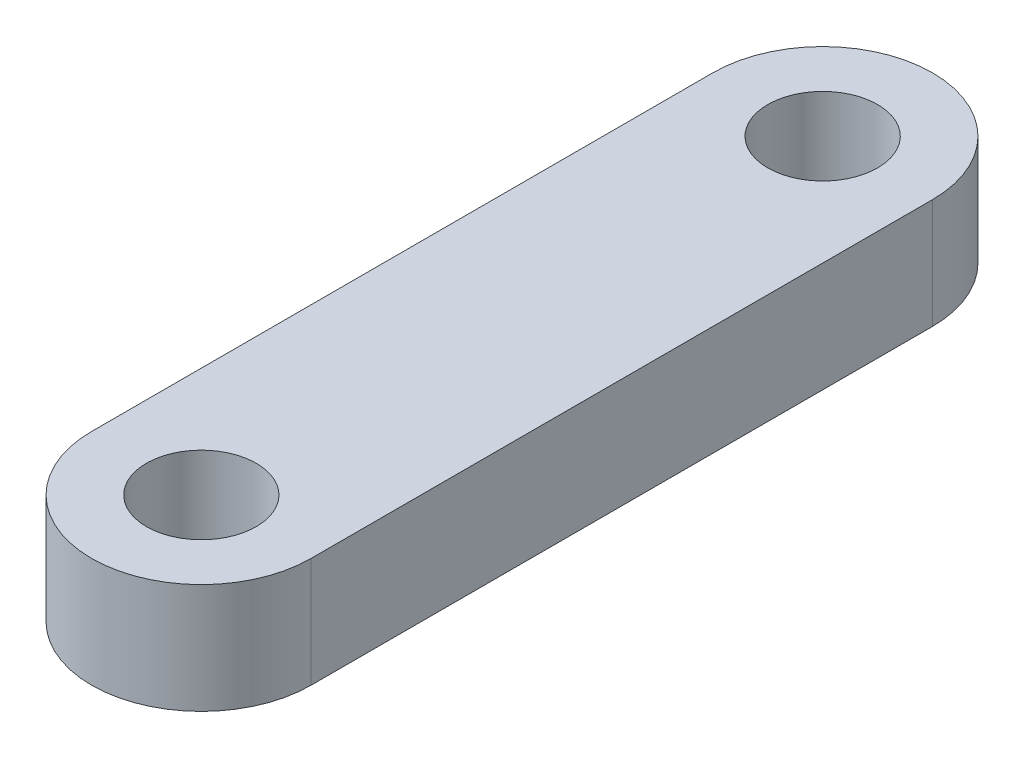
ISO-10303-21;
HEADER;
FILE_DESCRIPTION(('STEP AP214'),'2;1');
FILE_NAME('part.step','',(''),(''),'','','');
FILE_SCHEMA(('AUTOMOTIVE_DESIGN { 1 0 10303 214 1 1 1 1 }'));
ENDSEC;
DATA;
#1=APPLICATION_CONTEXT('core data for automotive mechanical design processes');
#2=APPLICATION_PROTOCOL_DEFINITION('international standard','automotive_design',2000,#1);
#3=PRODUCT_CONTEXT('',#1,'mechanical');
#4=PRODUCT('Part','Part','',(#3));
#5=PRODUCT_RELATED_PRODUCT_CATEGORY('part','',(#4));
#6=PRODUCT_DEFINITION_FORMATION('','',#4);
#7=PRODUCT_DEFINITION_CONTEXT('part definition',#1,'design');
#8=PRODUCT_DEFINITION('design','',#6,#7);
#9=PRODUCT_DEFINITION_SHAPE('','',#8);
#10=(LENGTH_UNIT() NAMED_UNIT(*) SI_UNIT(.MILLI.,.METRE.));
#11=(NAMED_UNIT(*) PLANE_ANGLE_UNIT() SI_UNIT($,.RADIAN.));
#12=(NAMED_UNIT(*) SI_UNIT($,.STERADIAN.) SOLID_ANGLE_UNIT());
#13=UNCERTAINTY_MEASURE_WITH_UNIT(LENGTH_MEASURE(1.E-05),#10,'distance_accuracy_value','');
#14=(GEOMETRIC_REPRESENTATION_CONTEXT(3) GLOBAL_UNCERTAINTY_ASSIGNED_CONTEXT((#13)) GLOBAL_UNIT_ASSIGNED_CONTEXT((#10,
#11,#12)) REPRESENTATION_CONTEXT('',''));
#15=CARTESIAN_POINT('',(0.,0.,0.));
#16=DIRECTION('',(0.,0.,1.));
#17=DIRECTION('',(1.,0.,0.));
#18=AXIS2_PLACEMENT_3D('',#15,#16,#17);
#19=CARTESIAN_POINT('',(0.,5.,-14.142135625));
#20=DIRECTION('',(0.,-1.,0.));
#21=DIRECTION('',(0.,0.,-1.));
#22=AXIS2_PLACEMENT_3D('',#19,#20,#21);
#23=CYLINDRICAL_SURFACE('',#22,5.);
#24=CARTESIAN_POINT('',(0.,0.,-14.142135625));
#25=DIRECTION('',(0.,1.,0.));
#26=DIRECTION('',(0.,0.,-1.));
#27=AXIS2_PLACEMENT_3D('',#24,#25,#26);
#28=CIRCLE('',#27,5.);
#29=CARTESIAN_POINT('',(5.,0.,-14.142135625));
#30=VERTEX_POINT('',#29);
#31=CARTESIAN_POINT('',(-5.,0.,-14.142135625));
#32=VERTEX_POINT('',#31);
#33=EDGE_CURVE('E96',#30,#32,#28,.T.);
#34=ORIENTED_EDGE('',*,*,#33,.T.);
#35=DIRECTION('',(0.,-1.,0.));
#36=VECTOR('',#35,1.);
#37=CARTESIAN_POINT('',(-5.,5.,-14.142135625));
#38=LINE('',#37,#36);
#39=CARTESIAN_POINT('',(-5.,5.,-14.142135625));
#40=VERTEX_POINT('',#39);
#41=EDGE_CURVE('E11',#40,#32,#38,.T.);
#42=ORIENTED_EDGE('',*,*,#41,.F.);
#43=CARTESIAN_POINT('',(0.,5.,-14.142135625));
#44=DIRECTION('',(0.,1.,0.));
#45=DIRECTION('',(0.,0.,-1.));
#46=AXIS2_PLACEMENT_3D('',#43,#44,#45);
#47=CIRCLE('',#46,5.);
#48=CARTESIAN_POINT('',(5.,5.,-14.142135625));
#49=VERTEX_POINT('',#48);
#50=EDGE_CURVE('E84',#49,#40,#47,.T.);
#51=ORIENTED_EDGE('',*,*,#50,.F.);
#52=DIRECTION('',(0.,-1.,0.));
#53=VECTOR('',#52,1.);
#54=CARTESIAN_POINT('',(5.,5.,-14.142135625));
#55=LINE('',#54,#53);
#56=EDGE_CURVE('E92',#49,#30,#55,.T.);
#57=ORIENTED_EDGE('',*,*,#56,.T.);
#58=EDGE_LOOP('',(#34,#42,#51,#57));
#59=FACE_BOUND('',#58,.T.);
#60=ADVANCED_FACE('F33',(#59),#23,.T.);
#61=CARTESIAN_POINT('',(-5.,5.,14.142135625));
#62=DIRECTION('',(1.,0.,0.));
#63=DIRECTION('',(0.,0.,-1.));
#64=AXIS2_PLACEMENT_3D('',#61,#62,#63);
#65=PLANE('',#64);
#66=DIRECTION('',(0.,0.,1.));
#67=VECTOR('',#66,1.);
#68=CARTESIAN_POINT('',(-5.,0.,14.142135625));
#69=LINE('',#68,#67);
#70=CARTESIAN_POINT('',(-5.,0.,14.142135625));
#71=VERTEX_POINT('',#70);
#72=EDGE_CURVE('E88',#32,#71,#69,.T.);
#73=ORIENTED_EDGE('',*,*,#72,.T.);
#74=DIRECTION('',(0.,-1.,0.));
#75=VECTOR('',#74,1.);
#76=CARTESIAN_POINT('',(-5.,5.,14.142135625));
#77=LINE('',#76,#75);
#78=CARTESIAN_POINT('',(-5.,5.,14.142135625));
#79=VERTEX_POINT('',#78);
#80=EDGE_CURVE('E41',#79,#71,#77,.T.);
#81=ORIENTED_EDGE('',*,*,#80,.F.);
#82=DIRECTION('',(0.,0.,1.));
#83=VECTOR('',#82,1.);
#84=CARTESIAN_POINT('',(-5.,5.,14.142135625));
#85=LINE('',#84,#83);
#86=EDGE_CURVE('E79',#40,#79,#85,.T.);
#87=ORIENTED_EDGE('',*,*,#86,.F.);
#88=ORIENTED_EDGE('',*,*,#41,.T.);
#89=EDGE_LOOP('',(#73,#81,#87,#88));
#90=FACE_BOUND('',#89,.T.);
#91=ADVANCED_FACE('F87',(#90),#65,.F.);
#92=CARTESIAN_POINT('',(0.,5.,14.142135625));
#93=DIRECTION('',(0.,-1.,0.));
#94=DIRECTION('',(0.,0.,-1.));
#95=AXIS2_PLACEMENT_3D('',#92,#93,#94);
#96=CYLINDRICAL_SURFACE('',#95,5.);
#97=CARTESIAN_POINT('',(0.,0.,14.142135625));
#98=DIRECTION('',(0.,1.,0.));
#99=DIRECTION('',(0.,0.,1.));
#100=AXIS2_PLACEMENT_3D('',#97,#98,#99);
#101=CIRCLE('',#100,5.);
#102=CARTESIAN_POINT('',(5.,0.,14.142135625));
#103=VERTEX_POINT('',#102);
#104=EDGE_CURVE('E66',#71,#103,#101,.T.);
#105=ORIENTED_EDGE('',*,*,#104,.T.);
#106=DIRECTION('',(0.,-1.,0.));
#107=VECTOR('',#106,1.);
#108=CARTESIAN_POINT('',(5.,5.,14.142135625));
#109=LINE('',#108,#107);
#110=CARTESIAN_POINT('',(5.,5.,14.142135625));
#111=VERTEX_POINT('',#110);
#112=EDGE_CURVE('E89',#111,#103,#109,.T.);
#113=ORIENTED_EDGE('',*,*,#112,.F.);
#114=CARTESIAN_POINT('',(0.,5.,14.142135625));
#115=DIRECTION('',(0.,1.,0.));
#116=DIRECTION('',(0.,0.,1.));
#117=AXIS2_PLACEMENT_3D('',#114,#115,#116);
#118=CIRCLE('',#117,5.);
#119=EDGE_CURVE('E82',#79,#111,#118,.T.);
#120=ORIENTED_EDGE('',*,*,#119,.F.);
#121=ORIENTED_EDGE('',*,*,#80,.T.);
#122=EDGE_LOOP('',(#105,#113,#120,#121));
#123=FACE_BOUND('',#122,.T.);
#124=ADVANCED_FACE('F90',(#123),#96,.T.);
#125=CARTESIAN_POINT('',(5.,5.,14.142135625));
#126=DIRECTION('',(-1.,0.,0.));
#127=DIRECTION('',(0.,0.,1.));
#128=AXIS2_PLACEMENT_3D('',#125,#126,#127);
#129=PLANE('',#128);
#130=DIRECTION('',(0.,0.,-1.));
#131=VECTOR('',#130,1.);
#132=CARTESIAN_POINT('',(5.,0.,14.142135625));
#133=LINE('',#132,#131);
#134=EDGE_CURVE('E72',#103,#30,#133,.T.);
#135=ORIENTED_EDGE('',*,*,#134,.T.);
#136=ORIENTED_EDGE('',*,*,#56,.F.);
#137=DIRECTION('',(0.,0.,-1.));
#138=VECTOR('',#137,1.);
#139=CARTESIAN_POINT('',(5.,5.,14.142135625));
#140=LINE('',#139,#138);
#141=EDGE_CURVE('E49',#111,#49,#140,.T.);
#142=ORIENTED_EDGE('',*,*,#141,.F.);
#143=ORIENTED_EDGE('',*,*,#112,.T.);
#144=EDGE_LOOP('',(#135,#136,#142,#143));
#145=FACE_BOUND('',#144,.T.);
#146=ADVANCED_FACE('F104',(#145),#129,.F.);
#147=CARTESIAN_POINT('',(0.,5.,-14.142135625));
#148=DIRECTION('',(0.,-1.,0.));
#149=DIRECTION('',(0.,0.,-1.));
#150=AXIS2_PLACEMENT_3D('',#147,#148,#149);
#151=PLANE('',#150);
#152=CARTESIAN_POINT('',(0.,5.,-14.142135625));
#153=DIRECTION('',(0.,1.,0.));
#154=DIRECTION('',(0.,0.,1.));
#155=AXIS2_PLACEMENT_3D('',#152,#153,#154);
#156=CIRCLE('',#155,2.5);
#157=CARTESIAN_POINT('',(0.,5.,-11.642135625));
#158=VERTEX_POINT('',#157);
#159=EDGE_CURVE('E116',#158,#158,#156,.T.);
#160=ORIENTED_EDGE('',*,*,#159,.F.);
#161=EDGE_LOOP('',(#160));
#162=FACE_BOUND('',#161,.T.);
#163=CARTESIAN_POINT('',(0.,5.,14.142135625));
#164=DIRECTION('',(0.,1.,0.));
#165=DIRECTION('',(0.,0.,1.));
#166=AXIS2_PLACEMENT_3D('',#163,#164,#165);
#167=CIRCLE('',#166,2.5);
#168=CARTESIAN_POINT('',(0.,5.,16.642135625));
#169=VERTEX_POINT('',#168);
#170=EDGE_CURVE('E110',#169,#169,#167,.T.);
#171=ORIENTED_EDGE('',*,*,#170,.F.);
#172=EDGE_LOOP('',(#171));
#173=FACE_BOUND('',#172,.T.);
#174=ORIENTED_EDGE('',*,*,#50,.T.);
#175=ORIENTED_EDGE('',*,*,#86,.T.);
#176=ORIENTED_EDGE('',*,*,#119,.T.);
#177=ORIENTED_EDGE('',*,*,#141,.T.);
#178=EDGE_LOOP('',(#174,#175,#176,#177));
#179=FACE_BOUND('',#178,.T.);
#180=ADVANCED_FACE('F80',(#162,#173,#179),#151,.F.);
#181=CARTESIAN_POINT('',(0.,0.,-14.142135625));
#182=DIRECTION('',(0.,-1.,0.));
#183=DIRECTION('',(0.,0.,-1.));
#184=AXIS2_PLACEMENT_3D('',#181,#182,#183);
#185=PLANE('',#184);
#186=CARTESIAN_POINT('',(0.,0.,-14.142135625));
#187=DIRECTION('',(0.,1.,0.));
#188=DIRECTION('',(0.,0.,1.));
#189=AXIS2_PLACEMENT_3D('',#186,#187,#188);
#190=CIRCLE('',#189,2.5);
#191=CARTESIAN_POINT('',(0.,0.,-11.642135625));
#192=VERTEX_POINT('',#191);
#193=EDGE_CURVE('E99',#192,#192,#190,.T.);
#194=ORIENTED_EDGE('',*,*,#193,.T.);
#195=EDGE_LOOP('',(#194));
#196=FACE_BOUND('',#195,.T.);
#197=CARTESIAN_POINT('',(0.,0.,14.142135625));
#198=DIRECTION('',(0.,1.,0.));
#199=DIRECTION('',(0.,0.,1.));
#200=AXIS2_PLACEMENT_3D('',#197,#198,#199);
#201=CIRCLE('',#200,2.5);
#202=CARTESIAN_POINT('',(0.,0.,16.642135625));
#203=VERTEX_POINT('',#202);
#204=EDGE_CURVE('E113',#203,#203,#201,.T.);
#205=ORIENTED_EDGE('',*,*,#204,.T.);
#206=EDGE_LOOP('',(#205));
#207=FACE_BOUND('',#206,.T.);
#208=ORIENTED_EDGE('',*,*,#33,.F.);
#209=ORIENTED_EDGE('',*,*,#134,.F.);
#210=ORIENTED_EDGE('',*,*,#104,.F.);
#211=ORIENTED_EDGE('',*,*,#72,.F.);
#212=EDGE_LOOP('',(#208,#209,#210,#211));
#213=FACE_BOUND('',#212,.T.);
#214=ADVANCED_FACE('F107',(#196,#207,#213),#185,.T.);
#215=CARTESIAN_POINT('',(0.,0.,14.142135625));
#216=DIRECTION('',(0.,1.,0.));
#217=DIRECTION('',(0.,0.,1.));
#218=AXIS2_PLACEMENT_3D('',#215,#216,#217);
#219=CYLINDRICAL_SURFACE('',#218,2.5);
#220=ORIENTED_EDGE('',*,*,#204,.F.);
#221=EDGE_LOOP('',(#220));
#222=FACE_BOUND('',#221,.T.);
#223=ORIENTED_EDGE('',*,*,#170,.T.);
#224=EDGE_LOOP('',(#223));
#225=FACE_BOUND('',#224,.T.);
#226=ADVANCED_FACE('F127',(#222,#225),#219,.F.);
#227=CARTESIAN_POINT('',(0.,0.,-14.142135625));
#228=DIRECTION('',(0.,1.,0.));
#229=DIRECTION('',(0.,0.,1.));
#230=AXIS2_PLACEMENT_3D('',#227,#228,#229);
#231=CYLINDRICAL_SURFACE('',#230,2.5);
#232=ORIENTED_EDGE('',*,*,#193,.F.);
#233=EDGE_LOOP('',(#232));
#234=FACE_BOUND('',#233,.T.);
#235=ORIENTED_EDGE('',*,*,#159,.T.);
#236=EDGE_LOOP('',(#235));
#237=FACE_BOUND('',#236,.T.);
#238=ADVANCED_FACE('F124',(#234,#237),#231,.F.);
#239=CLOSED_SHELL('',(#60,#91,#124,#146,#180,#214,#226,#238));
#240=MANIFOLD_SOLID_BREP('B2',#239);
#241=ADVANCED_BREP_SHAPE_REPRESENTATION('',(#18,#240),#14);
#242=SHAPE_DEFINITION_REPRESENTATION(#9,#241);
ENDSEC;
END-ISO-10303-21;
